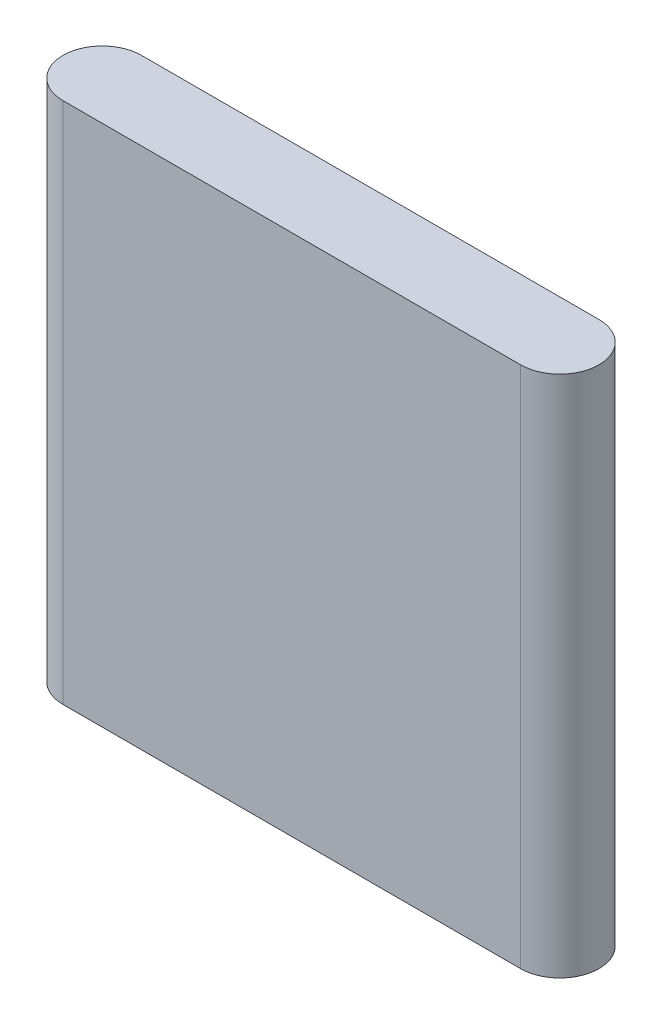
ISO-10303-21;
HEADER;
FILE_DESCRIPTION(('STEP AP214'),'2;1');
FILE_NAME('part.step','',(''),(''),'','','');
FILE_SCHEMA(('AUTOMOTIVE_DESIGN { 1 0 10303 214 1 1 1 1 }'));
ENDSEC;
DATA;
#1=APPLICATION_CONTEXT('core data for automotive mechanical design processes');
#2=APPLICATION_PROTOCOL_DEFINITION('international standard','automotive_design',2000,#1);
#3=PRODUCT_CONTEXT('',#1,'mechanical');
#4=PRODUCT('Part','Part','',(#3));
#5=PRODUCT_RELATED_PRODUCT_CATEGORY('part','',(#4));
#6=PRODUCT_DEFINITION_FORMATION('','',#4);
#7=PRODUCT_DEFINITION_CONTEXT('part definition',#1,'design');
#8=PRODUCT_DEFINITION('design','',#6,#7);
#9=PRODUCT_DEFINITION_SHAPE('','',#8);
#10=(LENGTH_UNIT() NAMED_UNIT(*) SI_UNIT(.MILLI.,.METRE.));
#11=(NAMED_UNIT(*) PLANE_ANGLE_UNIT() SI_UNIT($,.RADIAN.));
#12=(NAMED_UNIT(*) SI_UNIT($,.STERADIAN.) SOLID_ANGLE_UNIT());
#13=UNCERTAINTY_MEASURE_WITH_UNIT(LENGTH_MEASURE(1.E-05),#10,'distance_accuracy_value','');
#14=(GEOMETRIC_REPRESENTATION_CONTEXT(3) GLOBAL_UNCERTAINTY_ASSIGNED_CONTEXT((#13)) GLOBAL_UNIT_ASSIGNED_CONTEXT((#10,
#11,#12)) REPRESENTATION_CONTEXT('',''));
#15=CARTESIAN_POINT('',(0.,0.,0.));
#16=DIRECTION('',(0.,0.,1.));
#17=DIRECTION('',(1.,0.,0.));
#18=AXIS2_PLACEMENT_3D('',#15,#16,#17);
#19=CARTESIAN_POINT('',(-17.5,20.,0.));
#20=DIRECTION('',(0.,-1.,0.));
#21=DIRECTION('',(0.,0.,-1.));
#22=AXIS2_PLACEMENT_3D('',#19,#20,#21);
#23=CYLINDRICAL_SURFACE('',#22,3.00000000000001);
#24=CARTESIAN_POINT('',(-17.5,-20.,0.));
#25=DIRECTION('',(0.,1.,0.));
#26=DIRECTION('',(0.,0.,1.));
#27=AXIS2_PLACEMENT_3D('',#24,#25,#26);
#28=CIRCLE('',#27,3.00000000000001);
#29=CARTESIAN_POINT('',(-17.5,-20.,-3.00000000000001));
#30=VERTEX_POINT('',#29);
#31=CARTESIAN_POINT('',(-17.5,-20.,3.00000000000001));
#32=VERTEX_POINT('',#31);
#33=EDGE_CURVE('E98',#30,#32,#28,.T.);
#34=ORIENTED_EDGE('',*,*,#33,.T.);
#35=DIRECTION('',(0.,-1.,0.));
#36=VECTOR('',#35,1.);
#37=CARTESIAN_POINT('',(-17.5,20.,3.00000000000001));
#38=LINE('',#37,#36);
#39=CARTESIAN_POINT('',(-17.5,20.,3.00000000000001));
#40=VERTEX_POINT('',#39);
#41=EDGE_CURVE('E11',#40,#32,#38,.T.);
#42=ORIENTED_EDGE('',*,*,#41,.F.);
#43=CARTESIAN_POINT('',(-17.5,20.,0.));
#44=DIRECTION('',(0.,1.,0.));
#45=DIRECTION('',(0.,0.,1.));
#46=AXIS2_PLACEMENT_3D('',#43,#44,#45);
#47=CIRCLE('',#46,3.00000000000001);
#48=CARTESIAN_POINT('',(-17.5,20.,-3.00000000000001));
#49=VERTEX_POINT('',#48);
#50=EDGE_CURVE('E86',#49,#40,#47,.T.);
#51=ORIENTED_EDGE('',*,*,#50,.F.);
#52=DIRECTION('',(0.,-1.,0.));
#53=VECTOR('',#52,1.);
#54=CARTESIAN_POINT('',(-17.5,20.,-3.00000000000001));
#55=LINE('',#54,#53);
#56=EDGE_CURVE('E94',#49,#30,#55,.T.);
#57=ORIENTED_EDGE('',*,*,#56,.T.);
#58=EDGE_LOOP('',(#34,#42,#51,#57));
#59=FACE_BOUND('',#58,.T.);
#60=ADVANCED_FACE('F35',(#59),#23,.T.);
#61=CARTESIAN_POINT('',(-17.5,20.,3.00000000000001));
#62=DIRECTION('',(0.,0.,-1.));
#63=DIRECTION('',(-1.,0.,0.));
#64=AXIS2_PLACEMENT_3D('',#61,#62,#63);
#65=PLANE('',#64);
#66=DIRECTION('',(1.,0.,0.));
#67=VECTOR('',#66,1.);
#68=CARTESIAN_POINT('',(-17.5,-20.,3.00000000000001));
#69=LINE('',#68,#67);
#70=CARTESIAN_POINT('',(17.5,-20.,3.));
#71=VERTEX_POINT('',#70);
#72=EDGE_CURVE('E90',#32,#71,#69,.T.);
#73=ORIENTED_EDGE('',*,*,#72,.T.);
#74=DIRECTION('',(0.,-1.,0.));
#75=VECTOR('',#74,1.);
#76=CARTESIAN_POINT('',(17.5,20.,3.));
#77=LINE('',#76,#75);
#78=CARTESIAN_POINT('',(17.5,20.,3.));
#79=VERTEX_POINT('',#78);
#80=EDGE_CURVE('E43',#79,#71,#77,.T.);
#81=ORIENTED_EDGE('',*,*,#80,.F.);
#82=DIRECTION('',(1.,0.,0.));
#83=VECTOR('',#82,1.);
#84=CARTESIAN_POINT('',(-17.5,20.,3.00000000000001));
#85=LINE('',#84,#83);
#86=EDGE_CURVE('E81',#40,#79,#85,.T.);
#87=ORIENTED_EDGE('',*,*,#86,.F.);
#88=ORIENTED_EDGE('',*,*,#41,.T.);
#89=EDGE_LOOP('',(#73,#81,#87,#88));
#90=FACE_BOUND('',#89,.T.);
#91=ADVANCED_FACE('F89',(#90),#65,.F.);
#92=CARTESIAN_POINT('',(17.5,20.,0.));
#93=DIRECTION('',(0.,-1.,0.));
#94=DIRECTION('',(0.,0.,-1.));
#95=AXIS2_PLACEMENT_3D('',#92,#93,#94);
#96=CYLINDRICAL_SURFACE('',#95,3.00000000000001);
#97=CARTESIAN_POINT('',(17.5,-20.,0.));
#98=DIRECTION('',(0.,1.,0.));
#99=DIRECTION('',(0.,0.,1.));
#100=AXIS2_PLACEMENT_3D('',#97,#98,#99);
#101=CIRCLE('',#100,3.00000000000001);
#102=CARTESIAN_POINT('',(17.5,-20.,-3.00000000000001));
#103=VERTEX_POINT('',#102);
#104=EDGE_CURVE('E68',#71,#103,#101,.T.);
#105=ORIENTED_EDGE('',*,*,#104,.T.);
#106=DIRECTION('',(0.,-1.,0.));
#107=VECTOR('',#106,1.);
#108=CARTESIAN_POINT('',(17.5,20.,-3.00000000000001));
#109=LINE('',#108,#107);
#110=CARTESIAN_POINT('',(17.5,20.,-3.00000000000001));
#111=VERTEX_POINT('',#110);
#112=EDGE_CURVE('E91',#111,#103,#109,.T.);
#113=ORIENTED_EDGE('',*,*,#112,.F.);
#114=CARTESIAN_POINT('',(17.5,20.,0.));
#115=DIRECTION('',(0.,1.,0.));
#116=DIRECTION('',(0.,0.,1.));
#117=AXIS2_PLACEMENT_3D('',#114,#115,#116);
#118=CIRCLE('',#117,3.00000000000001);
#119=EDGE_CURVE('E84',#79,#111,#118,.T.);
#120=ORIENTED_EDGE('',*,*,#119,.F.);
#121=ORIENTED_EDGE('',*,*,#80,.T.);
#122=EDGE_LOOP('',(#105,#113,#120,#121));
#123=FACE_BOUND('',#122,.T.);
#124=ADVANCED_FACE('F92',(#123),#96,.T.);
#125=CARTESIAN_POINT('',(-17.5,20.,-3.00000000000001));
#126=DIRECTION('',(0.,0.,1.));
#127=DIRECTION('',(1.,0.,0.));
#128=AXIS2_PLACEMENT_3D('',#125,#126,#127);
#129=PLANE('',#128);
#130=DIRECTION('',(-1.,0.,0.));
#131=VECTOR('',#130,1.);
#132=CARTESIAN_POINT('',(-17.5,-20.,-3.00000000000001));
#133=LINE('',#132,#131);
#134=EDGE_CURVE('E74',#103,#30,#133,.T.);
#135=ORIENTED_EDGE('',*,*,#134,.T.);
#136=ORIENTED_EDGE('',*,*,#56,.F.);
#137=DIRECTION('',(-1.,0.,0.));
#138=VECTOR('',#137,1.);
#139=CARTESIAN_POINT('',(-17.5,20.,-3.00000000000001));
#140=LINE('',#139,#138);
#141=EDGE_CURVE('E51',#111,#49,#140,.T.);
#142=ORIENTED_EDGE('',*,*,#141,.F.);
#143=ORIENTED_EDGE('',*,*,#112,.T.);
#144=EDGE_LOOP('',(#135,#136,#142,#143));
#145=FACE_BOUND('',#144,.T.);
#146=ADVANCED_FACE('F105',(#145),#129,.F.);
#147=CARTESIAN_POINT('',(-17.5,20.,0.));
#148=DIRECTION('',(0.,1.,0.));
#149=DIRECTION('',(0.,0.,1.));
#150=AXIS2_PLACEMENT_3D('',#147,#148,#149);
#151=PLANE('',#150);
#152=ORIENTED_EDGE('',*,*,#50,.T.);
#153=ORIENTED_EDGE('',*,*,#86,.T.);
#154=ORIENTED_EDGE('',*,*,#119,.T.);
#155=ORIENTED_EDGE('',*,*,#141,.T.);
#156=EDGE_LOOP('',(#152,#153,#154,#155));
#157=FACE_BOUND('',#156,.T.);
#158=ADVANCED_FACE('F82',(#157),#151,.T.);
#159=CARTESIAN_POINT('',(-17.5,-20.,0.));
#160=DIRECTION('',(0.,1.,0.));
#161=DIRECTION('',(0.,0.,1.));
#162=AXIS2_PLACEMENT_3D('',#159,#160,#161);
#163=PLANE('',#162);
#164=ORIENTED_EDGE('',*,*,#33,.F.);
#165=ORIENTED_EDGE('',*,*,#134,.F.);
#166=ORIENTED_EDGE('',*,*,#104,.F.);
#167=ORIENTED_EDGE('',*,*,#72,.F.);
#168=EDGE_LOOP('',(#164,#165,#166,#167));
#169=FACE_BOUND('',#168,.T.);
#170=ADVANCED_FACE('F108',(#169),#163,.F.);
#171=CLOSED_SHELL('',(#60,#91,#124,#146,#158,#170));
#172=MANIFOLD_SOLID_BREP('B2',#171);
#173=ADVANCED_BREP_SHAPE_REPRESENTATION('',(#18,#172),#14);
#174=SHAPE_DEFINITION_REPRESENTATION(#9,#173);
ENDSEC;
END-ISO-10303-21;
